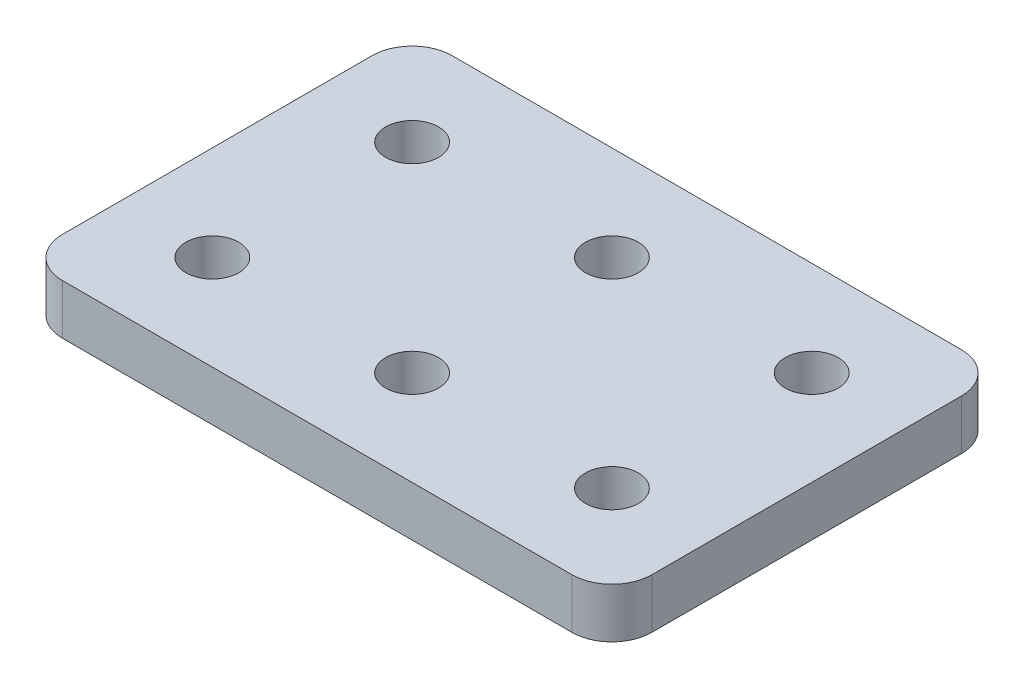
ISO-10303-21;
HEADER;
FILE_DESCRIPTION(('STEP AP214'),'2;1');
FILE_NAME('part.step','',(''),(''),'','','');
FILE_SCHEMA(('AUTOMOTIVE_DESIGN { 1 0 10303 214 1 1 1 1 }'));
ENDSEC;
DATA;
#1=APPLICATION_CONTEXT('core data for automotive mechanical design processes');
#2=APPLICATION_PROTOCOL_DEFINITION('international standard','automotive_design',2000,#1);
#3=PRODUCT_CONTEXT('',#1,'mechanical');
#4=PRODUCT('Part','Part','',(#3));
#5=PRODUCT_RELATED_PRODUCT_CATEGORY('part','',(#4));
#6=PRODUCT_DEFINITION_FORMATION('','',#4);
#7=PRODUCT_DEFINITION_CONTEXT('part definition',#1,'design');
#8=PRODUCT_DEFINITION('design','',#6,#7);
#9=PRODUCT_DEFINITION_SHAPE('','',#8);
#10=(LENGTH_UNIT() NAMED_UNIT(*) SI_UNIT(.MILLI.,.METRE.));
#11=(NAMED_UNIT(*) PLANE_ANGLE_UNIT() SI_UNIT($,.RADIAN.));
#12=(NAMED_UNIT(*) SI_UNIT($,.STERADIAN.) SOLID_ANGLE_UNIT());
#13=UNCERTAINTY_MEASURE_WITH_UNIT(LENGTH_MEASURE(1.E-05),#10,'distance_accuracy_value','');
#14=(GEOMETRIC_REPRESENTATION_CONTEXT(3) GLOBAL_UNCERTAINTY_ASSIGNED_CONTEXT((#13)) GLOBAL_UNIT_ASSIGNED_CONTEXT((#10,
#11,#12)) REPRESENTATION_CONTEXT('',''));
#15=CARTESIAN_POINT('',(0.,0.,0.));
#16=DIRECTION('',(0.,0.,1.));
#17=DIRECTION('',(1.,0.,0.));
#18=AXIS2_PLACEMENT_3D('',#15,#16,#17);
#19=CARTESIAN_POINT('',(-15.5,5.,15.5));
#20=DIRECTION('',(0.,1.,0.));
#21=DIRECTION('',(0.,0.,1.));
#22=AXIS2_PLACEMENT_3D('',#19,#20,#21);
#23=PLANE('',#22);
#24=CARTESIAN_POINT('',(-10.,5.,10.));
#25=DIRECTION('',(0.,1.,0.));
#26=DIRECTION('',(0.,0.,1.));
#27=AXIS2_PLACEMENT_3D('',#24,#25,#26);
#28=CIRCLE('',#27,2.65);
#29=CARTESIAN_POINT('',(-10.,5.,12.65));
#30=VERTEX_POINT('',#29);
#31=EDGE_CURVE('E164',#30,#30,#28,.T.);
#32=ORIENTED_EDGE('',*,*,#31,.F.);
#33=EDGE_LOOP('',(#32));
#34=FACE_BOUND('',#33,.T.);
#35=CARTESIAN_POINT('',(10.,5.,10.));
#36=DIRECTION('',(0.,1.,0.));
#37=DIRECTION('',(0.,0.,1.));
#38=AXIS2_PLACEMENT_3D('',#35,#36,#37);
#39=CIRCLE('',#38,2.65);
#40=CARTESIAN_POINT('',(10.,5.,12.65));
#41=VERTEX_POINT('',#40);
#42=EDGE_CURVE('E176',#41,#41,#39,.T.);
#43=ORIENTED_EDGE('',*,*,#42,.F.);
#44=EDGE_LOOP('',(#43));
#45=FACE_BOUND('',#44,.T.);
#46=CARTESIAN_POINT('',(-15.5,5.,15.5));
#47=DIRECTION('',(0.,1.,0.));
#48=DIRECTION('',(0.,0.,1.));
#49=AXIS2_PLACEMENT_3D('',#46,#47,#48);
#50=CIRCLE('',#49,4.);
#51=CARTESIAN_POINT('',(-19.5,5.,15.5));
#52=VERTEX_POINT('',#51);
#53=CARTESIAN_POINT('',(-15.5,5.,19.5));
#54=VERTEX_POINT('',#53);
#55=EDGE_CURVE('E112',#52,#54,#50,.T.);
#56=ORIENTED_EDGE('',*,*,#55,.T.);
#57=DIRECTION('',(1.,0.,0.));
#58=VECTOR('',#57,1.);
#59=CARTESIAN_POINT('',(-15.5,5.,19.5));
#60=LINE('',#59,#58);
#61=CARTESIAN_POINT('',(35.5,5.,19.5));
#62=VERTEX_POINT('',#61);
#63=EDGE_CURVE('E82',#54,#62,#60,.T.);
#64=ORIENTED_EDGE('',*,*,#63,.T.);
#65=CARTESIAN_POINT('',(35.5,5.,15.5));
#66=DIRECTION('',(0.,1.,0.));
#67=DIRECTION('',(0.,0.,1.));
#68=AXIS2_PLACEMENT_3D('',#65,#66,#67);
#69=CIRCLE('',#68,4.);
#70=CARTESIAN_POINT('',(39.5,5.,15.5));
#71=VERTEX_POINT('',#70);
#72=EDGE_CURVE('E110',#62,#71,#69,.T.);
#73=ORIENTED_EDGE('',*,*,#72,.T.);
#74=DIRECTION('',(0.,0.,-1.));
#75=VECTOR('',#74,1.);
#76=CARTESIAN_POINT('',(39.5,5.,15.5));
#77=LINE('',#76,#75);
#78=CARTESIAN_POINT('',(39.5,5.,-15.5));
#79=VERTEX_POINT('',#78);
#80=EDGE_CURVE('E130',#71,#79,#77,.T.);
#81=ORIENTED_EDGE('',*,*,#80,.T.);
#82=CARTESIAN_POINT('',(35.5,5.,-15.5));
#83=DIRECTION('',(0.,1.,0.));
#84=DIRECTION('',(0.,0.,1.));
#85=AXIS2_PLACEMENT_3D('',#82,#83,#84);
#86=CIRCLE('',#85,4.);
#87=CARTESIAN_POINT('',(35.5,5.,-19.5));
#88=VERTEX_POINT('',#87);
#89=EDGE_CURVE('E135',#79,#88,#86,.T.);
#90=ORIENTED_EDGE('',*,*,#89,.T.);
#91=DIRECTION('',(-1.,0.,0.));
#92=VECTOR('',#91,1.);
#93=CARTESIAN_POINT('',(-15.5,5.,-19.5));
#94=LINE('',#93,#92);
#95=CARTESIAN_POINT('',(-15.5,5.,-19.5));
#96=VERTEX_POINT('',#95);
#97=EDGE_CURVE('E114',#88,#96,#94,.T.);
#98=ORIENTED_EDGE('',*,*,#97,.T.);
#99=CARTESIAN_POINT('',(-15.5,5.,-15.5));
#100=DIRECTION('',(0.,1.,0.));
#101=DIRECTION('',(0.,0.,-1.));
#102=AXIS2_PLACEMENT_3D('',#99,#100,#101);
#103=CIRCLE('',#102,4.);
#104=CARTESIAN_POINT('',(-19.5,5.,-15.5));
#105=VERTEX_POINT('',#104);
#106=EDGE_CURVE('E184',#96,#105,#103,.T.);
#107=ORIENTED_EDGE('',*,*,#106,.T.);
#108=DIRECTION('',(0.,0.,1.));
#109=VECTOR('',#108,1.);
#110=CARTESIAN_POINT('',(-19.5,5.,15.5));
#111=LINE('',#110,#109);
#112=EDGE_CURVE('E51',#105,#52,#111,.T.);
#113=ORIENTED_EDGE('',*,*,#112,.T.);
#114=EDGE_LOOP('',(#56,#64,#73,#81,#90,#98,#107,#113));
#115=FACE_BOUND('',#114,.T.);
#116=CARTESIAN_POINT('',(10.,5.,-10.));
#117=DIRECTION('',(0.,1.,0.));
#118=DIRECTION('',(0.,0.,1.));
#119=AXIS2_PLACEMENT_3D('',#116,#117,#118);
#120=CIRCLE('',#119,2.65);
#121=CARTESIAN_POINT('',(10.,5.,-7.35));
#122=VERTEX_POINT('',#121);
#123=EDGE_CURVE('E170',#122,#122,#120,.T.);
#124=ORIENTED_EDGE('',*,*,#123,.F.);
#125=EDGE_LOOP('',(#124));
#126=FACE_BOUND('',#125,.T.);
#127=CARTESIAN_POINT('',(-10.,5.,-10.));
#128=DIRECTION('',(0.,1.,0.));
#129=DIRECTION('',(0.,0.,1.));
#130=AXIS2_PLACEMENT_3D('',#127,#128,#129);
#131=CIRCLE('',#130,2.65);
#132=CARTESIAN_POINT('',(-10.,5.,-7.35));
#133=VERTEX_POINT('',#132);
#134=EDGE_CURVE('E158',#133,#133,#131,.T.);
#135=ORIENTED_EDGE('',*,*,#134,.F.);
#136=EDGE_LOOP('',(#135));
#137=FACE_BOUND('',#136,.T.);
#138=CARTESIAN_POINT('',(30.,5.,10.));
#139=DIRECTION('',(0.,1.,0.));
#140=DIRECTION('',(0.,0.,1.));
#141=AXIS2_PLACEMENT_3D('',#138,#139,#140);
#142=CIRCLE('',#141,2.65);
#143=CARTESIAN_POINT('',(30.,5.,12.65));
#144=VERTEX_POINT('',#143);
#145=EDGE_CURVE('E154',#144,#144,#142,.T.);
#146=ORIENTED_EDGE('',*,*,#145,.F.);
#147=EDGE_LOOP('',(#146));
#148=FACE_BOUND('',#147,.T.);
#149=CARTESIAN_POINT('',(30.,5.,-10.));
#150=DIRECTION('',(0.,1.,0.));
#151=DIRECTION('',(0.,0.,1.));
#152=AXIS2_PLACEMENT_3D('',#149,#150,#151);
#153=CIRCLE('',#152,2.65);
#154=CARTESIAN_POINT('',(30.,5.,-7.35));
#155=VERTEX_POINT('',#154);
#156=EDGE_CURVE('E157',#155,#155,#153,.T.);
#157=ORIENTED_EDGE('',*,*,#156,.F.);
#158=EDGE_LOOP('',(#157));
#159=FACE_BOUND('',#158,.T.);
#160=ADVANCED_FACE('F34',(#34,#45,#115,#126,#137,#148,#159),#23,.T.);
#161=CARTESIAN_POINT('',(-15.5,0.,15.5));
#162=DIRECTION('',(0.,1.,0.));
#163=DIRECTION('',(0.,0.,1.));
#164=AXIS2_PLACEMENT_3D('',#161,#162,#163);
#165=PLANE('',#164);
#166=CARTESIAN_POINT('',(-15.5,0.,15.5));
#167=DIRECTION('',(0.,1.,0.));
#168=DIRECTION('',(0.,0.,1.));
#169=AXIS2_PLACEMENT_3D('',#166,#167,#168);
#170=CIRCLE('',#169,4.);
#171=CARTESIAN_POINT('',(-19.5,0.,15.5));
#172=VERTEX_POINT('',#171);
#173=CARTESIAN_POINT('',(-15.5,0.,19.5));
#174=VERTEX_POINT('',#173);
#175=EDGE_CURVE('E179',#172,#174,#170,.T.);
#176=ORIENTED_EDGE('',*,*,#175,.F.);
#177=DIRECTION('',(0.,0.,1.));
#178=VECTOR('',#177,1.);
#179=CARTESIAN_POINT('',(-19.5,0.,15.5));
#180=LINE('',#179,#178);
#181=CARTESIAN_POINT('',(-19.5,0.,-15.5));
#182=VERTEX_POINT('',#181);
#183=EDGE_CURVE('E75',#182,#172,#180,.T.);
#184=ORIENTED_EDGE('',*,*,#183,.F.);
#185=CARTESIAN_POINT('',(-15.5,0.,-15.5));
#186=DIRECTION('',(0.,1.,0.));
#187=DIRECTION('',(0.,0.,-1.));
#188=AXIS2_PLACEMENT_3D('',#185,#186,#187);
#189=CIRCLE('',#188,4.);
#190=CARTESIAN_POINT('',(-15.5,0.,-19.5));
#191=VERTEX_POINT('',#190);
#192=EDGE_CURVE('E69',#191,#182,#189,.T.);
#193=ORIENTED_EDGE('',*,*,#192,.F.);
#194=DIRECTION('',(-1.,0.,0.));
#195=VECTOR('',#194,1.);
#196=CARTESIAN_POINT('',(-15.5,0.,-19.5));
#197=LINE('',#196,#195);
#198=CARTESIAN_POINT('',(35.5,0.,-19.5));
#199=VERTEX_POINT('',#198);
#200=EDGE_CURVE('E191',#199,#191,#197,.T.);
#201=ORIENTED_EDGE('',*,*,#200,.F.);
#202=CARTESIAN_POINT('',(35.5,0.,-15.5));
#203=DIRECTION('',(0.,1.,0.));
#204=DIRECTION('',(0.,0.,-1.));
#205=AXIS2_PLACEMENT_3D('',#202,#203,#204);
#206=CIRCLE('',#205,4.);
#207=CARTESIAN_POINT('',(39.5,0.,-15.5));
#208=VERTEX_POINT('',#207);
#209=EDGE_CURVE('E124',#208,#199,#206,.T.);
#210=ORIENTED_EDGE('',*,*,#209,.F.);
#211=DIRECTION('',(0.,0.,-1.));
#212=VECTOR('',#211,1.);
#213=CARTESIAN_POINT('',(39.5,0.,15.5));
#214=LINE('',#213,#212);
#215=CARTESIAN_POINT('',(39.5,0.,15.5));
#216=VERTEX_POINT('',#215);
#217=EDGE_CURVE('E143',#216,#208,#214,.T.);
#218=ORIENTED_EDGE('',*,*,#217,.F.);
#219=CARTESIAN_POINT('',(35.5,0.,15.5));
#220=DIRECTION('',(0.,1.,0.));
#221=DIRECTION('',(0.,0.,-1.));
#222=AXIS2_PLACEMENT_3D('',#219,#220,#221);
#223=CIRCLE('',#222,4.);
#224=CARTESIAN_POINT('',(35.5,0.,19.5));
#225=VERTEX_POINT('',#224);
#226=EDGE_CURVE('E141',#225,#216,#223,.T.);
#227=ORIENTED_EDGE('',*,*,#226,.F.);
#228=DIRECTION('',(1.,0.,0.));
#229=VECTOR('',#228,1.);
#230=CARTESIAN_POINT('',(-15.5,0.,19.5));
#231=LINE('',#230,#229);
#232=EDGE_CURVE('E119',#174,#225,#231,.T.);
#233=ORIENTED_EDGE('',*,*,#232,.F.);
#234=EDGE_LOOP('',(#176,#184,#193,#201,#210,#218,#227,#233));
#235=FACE_BOUND('',#234,.T.);
#236=CARTESIAN_POINT('',(10.,0.,10.));
#237=DIRECTION('',(0.,1.,0.));
#238=DIRECTION('',(0.,0.,1.));
#239=AXIS2_PLACEMENT_3D('',#236,#237,#238);
#240=CIRCLE('',#239,2.65);
#241=CARTESIAN_POINT('',(10.,0.,12.65));
#242=VERTEX_POINT('',#241);
#243=EDGE_CURVE('E173',#242,#242,#240,.T.);
#244=ORIENTED_EDGE('',*,*,#243,.T.);
#245=EDGE_LOOP('',(#244));
#246=FACE_BOUND('',#245,.T.);
#247=CARTESIAN_POINT('',(10.,0.,-10.));
#248=DIRECTION('',(0.,1.,0.));
#249=DIRECTION('',(0.,0.,1.));
#250=AXIS2_PLACEMENT_3D('',#247,#248,#249);
#251=CIRCLE('',#250,2.65);
#252=CARTESIAN_POINT('',(10.,0.,-7.35));
#253=VERTEX_POINT('',#252);
#254=EDGE_CURVE('E167',#253,#253,#251,.T.);
#255=ORIENTED_EDGE('',*,*,#254,.T.);
#256=EDGE_LOOP('',(#255));
#257=FACE_BOUND('',#256,.T.);
#258=CARTESIAN_POINT('',(-10.,0.,10.));
#259=DIRECTION('',(0.,1.,0.));
#260=DIRECTION('',(0.,0.,1.));
#261=AXIS2_PLACEMENT_3D('',#258,#259,#260);
#262=CIRCLE('',#261,2.65);
#263=CARTESIAN_POINT('',(-10.,0.,12.65));
#264=VERTEX_POINT('',#263);
#265=EDGE_CURVE('E161',#264,#264,#262,.T.);
#266=ORIENTED_EDGE('',*,*,#265,.T.);
#267=EDGE_LOOP('',(#266));
#268=FACE_BOUND('',#267,.T.);
#269=CARTESIAN_POINT('',(-10.,0.,-10.));
#270=DIRECTION('',(0.,1.,0.));
#271=DIRECTION('',(0.,0.,1.));
#272=AXIS2_PLACEMENT_3D('',#269,#270,#271);
#273=CIRCLE('',#272,2.65);
#274=CARTESIAN_POINT('',(-10.,0.,-7.35));
#275=VERTEX_POINT('',#274);
#276=EDGE_CURVE('E153',#275,#275,#273,.T.);
#277=ORIENTED_EDGE('',*,*,#276,.T.);
#278=EDGE_LOOP('',(#277));
#279=FACE_BOUND('',#278,.T.);
#280=CARTESIAN_POINT('',(30.,0.,-10.));
#281=DIRECTION('',(0.,1.,0.));
#282=DIRECTION('',(0.,0.,1.));
#283=AXIS2_PLACEMENT_3D('',#280,#281,#282);
#284=CIRCLE('',#283,2.65);
#285=CARTESIAN_POINT('',(30.,0.,-7.35));
#286=VERTEX_POINT('',#285);
#287=EDGE_CURVE('E133',#286,#286,#284,.T.);
#288=ORIENTED_EDGE('',*,*,#287,.T.);
#289=EDGE_LOOP('',(#288));
#290=FACE_BOUND('',#289,.T.);
#291=CARTESIAN_POINT('',(30.,0.,10.));
#292=DIRECTION('',(0.,1.,0.));
#293=DIRECTION('',(0.,0.,1.));
#294=AXIS2_PLACEMENT_3D('',#291,#292,#293);
#295=CIRCLE('',#294,2.65);
#296=CARTESIAN_POINT('',(30.,0.,12.65));
#297=VERTEX_POINT('',#296);
#298=EDGE_CURVE('E129',#297,#297,#295,.T.);
#299=ORIENTED_EDGE('',*,*,#298,.T.);
#300=EDGE_LOOP('',(#299));
#301=FACE_BOUND('',#300,.T.);
#302=ADVANCED_FACE('F203',(#235,#246,#257,#268,#279,#290,#301),#165,.F.);
#303=CARTESIAN_POINT('',(-15.5,5.,15.5));
#304=DIRECTION('',(0.,-1.,0.));
#305=DIRECTION('',(0.,0.,-1.));
#306=AXIS2_PLACEMENT_3D('',#303,#304,#305);
#307=CYLINDRICAL_SURFACE('',#306,4.);
#308=ORIENTED_EDGE('',*,*,#175,.T.);
#309=DIRECTION('',(0.,-1.,0.));
#310=VECTOR('',#309,1.);
#311=CARTESIAN_POINT('',(-15.5,5.,19.5));
#312=LINE('',#311,#310);
#313=EDGE_CURVE('E11',#54,#174,#312,.T.);
#314=ORIENTED_EDGE('',*,*,#313,.F.);
#315=ORIENTED_EDGE('',*,*,#55,.F.);
#316=DIRECTION('',(0.,-1.,0.));
#317=VECTOR('',#316,1.);
#318=CARTESIAN_POINT('',(-19.5,5.,15.5));
#319=LINE('',#318,#317);
#320=EDGE_CURVE('E187',#52,#172,#319,.T.);
#321=ORIENTED_EDGE('',*,*,#320,.T.);
#322=EDGE_LOOP('',(#308,#314,#315,#321));
#323=FACE_BOUND('',#322,.T.);
#324=ADVANCED_FACE('F36',(#323),#307,.T.);
#325=CARTESIAN_POINT('',(-15.5,5.,19.5));
#326=DIRECTION('',(0.,0.,-1.));
#327=DIRECTION('',(-1.,0.,0.));
#328=AXIS2_PLACEMENT_3D('',#325,#326,#327);
#329=PLANE('',#328);
#330=ORIENTED_EDGE('',*,*,#232,.T.);
#331=DIRECTION('',(0.,-1.,0.));
#332=VECTOR('',#331,1.);
#333=CARTESIAN_POINT('',(35.5,50.7930125674213,19.5));
#334=LINE('',#333,#332);
#335=EDGE_CURVE('E117',#62,#225,#334,.T.);
#336=ORIENTED_EDGE('',*,*,#335,.F.);
#337=ORIENTED_EDGE('',*,*,#63,.F.);
#338=ORIENTED_EDGE('',*,*,#313,.T.);
#339=EDGE_LOOP('',(#330,#336,#337,#338));
#340=FACE_BOUND('',#339,.T.);
#341=ADVANCED_FACE('F118',(#340),#329,.F.);
#342=CARTESIAN_POINT('',(-15.5,5.,-19.5));
#343=DIRECTION('',(0.,0.,1.));
#344=DIRECTION('',(1.,0.,0.));
#345=AXIS2_PLACEMENT_3D('',#342,#343,#344);
#346=PLANE('',#345);
#347=ORIENTED_EDGE('',*,*,#200,.T.);
#348=DIRECTION('',(0.,-1.,0.));
#349=VECTOR('',#348,1.);
#350=CARTESIAN_POINT('',(-15.5,5.,-19.5));
#351=LINE('',#350,#349);
#352=EDGE_CURVE('E43',#96,#191,#351,.T.);
#353=ORIENTED_EDGE('',*,*,#352,.F.);
#354=ORIENTED_EDGE('',*,*,#97,.F.);
#355=DIRECTION('',(0.,-1.,0.));
#356=VECTOR('',#355,1.);
#357=CARTESIAN_POINT('',(35.5,50.7930125674213,-19.5));
#358=LINE('',#357,#356);
#359=EDGE_CURVE('E123',#88,#199,#358,.T.);
#360=ORIENTED_EDGE('',*,*,#359,.T.);
#361=EDGE_LOOP('',(#347,#353,#354,#360));
#362=FACE_BOUND('',#361,.T.);
#363=ADVANCED_FACE('F218',(#362),#346,.F.);
#364=CARTESIAN_POINT('',(-15.5,5.,-15.5));
#365=DIRECTION('',(0.,-1.,0.));
#366=DIRECTION('',(0.,0.,-1.));
#367=AXIS2_PLACEMENT_3D('',#364,#365,#366);
#368=CYLINDRICAL_SURFACE('',#367,4.);
#369=ORIENTED_EDGE('',*,*,#192,.T.);
#370=DIRECTION('',(0.,-1.,0.));
#371=VECTOR('',#370,1.);
#372=CARTESIAN_POINT('',(-19.5,5.,-15.5));
#373=LINE('',#372,#371);
#374=EDGE_CURVE('E196',#105,#182,#373,.T.);
#375=ORIENTED_EDGE('',*,*,#374,.F.);
#376=ORIENTED_EDGE('',*,*,#106,.F.);
#377=ORIENTED_EDGE('',*,*,#352,.T.);
#378=EDGE_LOOP('',(#369,#375,#376,#377));
#379=FACE_BOUND('',#378,.T.);
#380=ADVANCED_FACE('F199',(#379),#368,.T.);
#381=CARTESIAN_POINT('',(-19.5,5.,15.5));
#382=DIRECTION('',(1.,0.,0.));
#383=DIRECTION('',(0.,0.,-1.));
#384=AXIS2_PLACEMENT_3D('',#381,#382,#383);
#385=PLANE('',#384);
#386=ORIENTED_EDGE('',*,*,#183,.T.);
#387=ORIENTED_EDGE('',*,*,#320,.F.);
#388=ORIENTED_EDGE('',*,*,#112,.F.);
#389=ORIENTED_EDGE('',*,*,#374,.T.);
#390=EDGE_LOOP('',(#386,#387,#388,#389));
#391=FACE_BOUND('',#390,.T.);
#392=ADVANCED_FACE('F207',(#391),#385,.F.);
#393=CARTESIAN_POINT('',(10.,5.,10.));
#394=DIRECTION('',(0.,-1.,0.));
#395=DIRECTION('',(0.,0.,-1.));
#396=AXIS2_PLACEMENT_3D('',#393,#394,#395);
#397=CYLINDRICAL_SURFACE('',#396,2.65);
#398=ORIENTED_EDGE('',*,*,#42,.T.);
#399=EDGE_LOOP('',(#398));
#400=FACE_BOUND('',#399,.T.);
#401=ORIENTED_EDGE('',*,*,#243,.F.);
#402=EDGE_LOOP('',(#401));
#403=FACE_BOUND('',#402,.T.);
#404=ADVANCED_FACE('F209',(#400,#403),#397,.F.);
#405=CARTESIAN_POINT('',(10.,5.,-10.));
#406=DIRECTION('',(0.,-1.,0.));
#407=DIRECTION('',(0.,0.,-1.));
#408=AXIS2_PLACEMENT_3D('',#405,#406,#407);
#409=CYLINDRICAL_SURFACE('',#408,2.65);
#410=ORIENTED_EDGE('',*,*,#123,.T.);
#411=EDGE_LOOP('',(#410));
#412=FACE_BOUND('',#411,.T.);
#413=ORIENTED_EDGE('',*,*,#254,.F.);
#414=EDGE_LOOP('',(#413));
#415=FACE_BOUND('',#414,.T.);
#416=ADVANCED_FACE('F215',(#412,#415),#409,.F.);
#417=CARTESIAN_POINT('',(-10.,5.,10.));
#418=DIRECTION('',(0.,-1.,0.));
#419=DIRECTION('',(0.,0.,-1.));
#420=AXIS2_PLACEMENT_3D('',#417,#418,#419);
#421=CYLINDRICAL_SURFACE('',#420,2.65);
#422=ORIENTED_EDGE('',*,*,#31,.T.);
#423=EDGE_LOOP('',(#422));
#424=FACE_BOUND('',#423,.T.);
#425=ORIENTED_EDGE('',*,*,#265,.F.);
#426=EDGE_LOOP('',(#425));
#427=FACE_BOUND('',#426,.T.);
#428=ADVANCED_FACE('F232',(#424,#427),#421,.F.);
#429=CARTESIAN_POINT('',(-10.,5.,-10.));
#430=DIRECTION('',(0.,-1.,0.));
#431=DIRECTION('',(0.,0.,-1.));
#432=AXIS2_PLACEMENT_3D('',#429,#430,#431);
#433=CYLINDRICAL_SURFACE('',#432,2.65);
#434=ORIENTED_EDGE('',*,*,#134,.T.);
#435=EDGE_LOOP('',(#434));
#436=FACE_BOUND('',#435,.T.);
#437=ORIENTED_EDGE('',*,*,#276,.F.);
#438=EDGE_LOOP('',(#437));
#439=FACE_BOUND('',#438,.T.);
#440=ADVANCED_FACE('F236',(#436,#439),#433,.F.);
#441=CARTESIAN_POINT('',(35.5,50.7930125674213,-15.5));
#442=DIRECTION('',(0.,-1.,0.));
#443=DIRECTION('',(0.,0.,-1.));
#444=AXIS2_PLACEMENT_3D('',#441,#442,#443);
#445=CYLINDRICAL_SURFACE('',#444,4.);
#446=ORIENTED_EDGE('',*,*,#89,.F.);
#447=DIRECTION('',(0.,-1.,0.));
#448=VECTOR('',#447,1.);
#449=CARTESIAN_POINT('',(39.5,50.7930125674213,-15.5));
#450=LINE('',#449,#448);
#451=EDGE_CURVE('E150',#79,#208,#450,.T.);
#452=ORIENTED_EDGE('',*,*,#451,.T.);
#453=ORIENTED_EDGE('',*,*,#209,.T.);
#454=ORIENTED_EDGE('',*,*,#359,.F.);
#455=EDGE_LOOP('',(#446,#452,#453,#454));
#456=FACE_BOUND('',#455,.T.);
#457=ADVANCED_FACE('F240',(#456),#445,.T.);
#458=CARTESIAN_POINT('',(39.5,50.7930125674213,15.5));
#459=DIRECTION('',(-1.,0.,0.));
#460=DIRECTION('',(0.,0.,1.));
#461=AXIS2_PLACEMENT_3D('',#458,#459,#460);
#462=PLANE('',#461);
#463=ORIENTED_EDGE('',*,*,#80,.F.);
#464=DIRECTION('',(0.,-1.,0.));
#465=VECTOR('',#464,1.);
#466=CARTESIAN_POINT('',(39.5,50.7930125674213,15.5));
#467=LINE('',#466,#465);
#468=EDGE_CURVE('E128',#71,#216,#467,.T.);
#469=ORIENTED_EDGE('',*,*,#468,.T.);
#470=ORIENTED_EDGE('',*,*,#217,.T.);
#471=ORIENTED_EDGE('',*,*,#451,.F.);
#472=EDGE_LOOP('',(#463,#469,#470,#471));
#473=FACE_BOUND('',#472,.T.);
#474=ADVANCED_FACE('F245',(#473),#462,.F.);
#475=CARTESIAN_POINT('',(35.5,50.7930125674213,15.5));
#476=DIRECTION('',(0.,-1.,0.));
#477=DIRECTION('',(0.,0.,-1.));
#478=AXIS2_PLACEMENT_3D('',#475,#476,#477);
#479=CYLINDRICAL_SURFACE('',#478,4.);
#480=ORIENTED_EDGE('',*,*,#72,.F.);
#481=ORIENTED_EDGE('',*,*,#335,.T.);
#482=ORIENTED_EDGE('',*,*,#226,.T.);
#483=ORIENTED_EDGE('',*,*,#468,.F.);
#484=EDGE_LOOP('',(#480,#481,#482,#483));
#485=FACE_BOUND('',#484,.T.);
#486=ADVANCED_FACE('F127',(#485),#479,.T.);
#487=CARTESIAN_POINT('',(30.,50.7930125674213,-10.));
#488=DIRECTION('',(0.,-1.,0.));
#489=DIRECTION('',(0.,0.,-1.));
#490=AXIS2_PLACEMENT_3D('',#487,#488,#489);
#491=CYLINDRICAL_SURFACE('',#490,2.65);
#492=ORIENTED_EDGE('',*,*,#287,.F.);
#493=EDGE_LOOP('',(#492));
#494=FACE_BOUND('',#493,.T.);
#495=ORIENTED_EDGE('',*,*,#156,.T.);
#496=EDGE_LOOP('',(#495));
#497=FACE_BOUND('',#496,.T.);
#498=ADVANCED_FACE('F244',(#494,#497),#491,.F.);
#499=CARTESIAN_POINT('',(30.,50.7930125674213,10.));
#500=DIRECTION('',(0.,-1.,0.));
#501=DIRECTION('',(0.,0.,-1.));
#502=AXIS2_PLACEMENT_3D('',#499,#500,#501);
#503=CYLINDRICAL_SURFACE('',#502,2.65);
#504=ORIENTED_EDGE('',*,*,#298,.F.);
#505=EDGE_LOOP('',(#504));
#506=FACE_BOUND('',#505,.T.);
#507=ORIENTED_EDGE('',*,*,#145,.T.);
#508=EDGE_LOOP('',(#507));
#509=FACE_BOUND('',#508,.T.);
#510=ADVANCED_FACE('F254',(#506,#509),#503,.F.);
#511=CLOSED_SHELL('',(#160,#302,#324,#341,#363,#380,#392,#404,#416,#428,#440,#457,#474,#486,
#498,#510));
#512=MANIFOLD_SOLID_BREP('B2',#511);
#513=ADVANCED_BREP_SHAPE_REPRESENTATION('',(#18,#512),#14);
#514=SHAPE_DEFINITION_REPRESENTATION(#9,#513);
ENDSEC;
END-ISO-10303-21;
